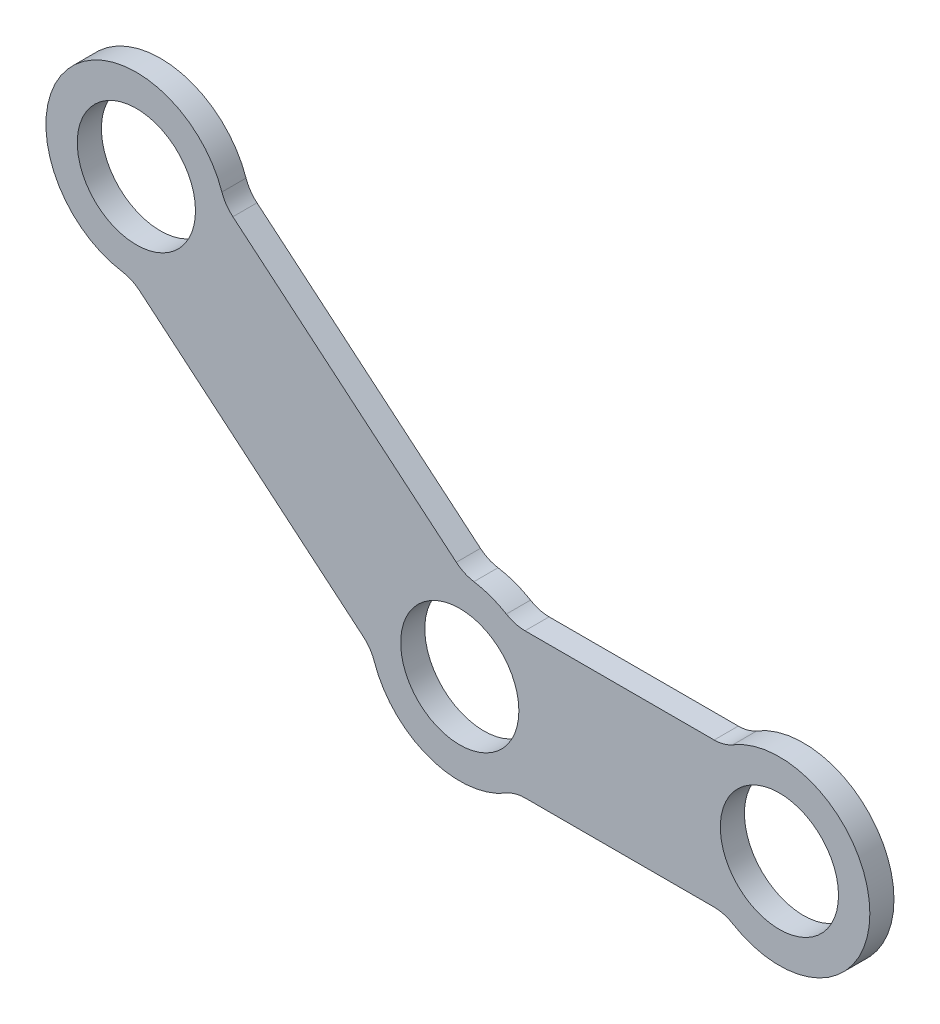
ISO-10303-21;
HEADER;
FILE_DESCRIPTION(('STEP AP214'),'2;1');
FILE_NAME('part.step','',(''),(''),'','','');
FILE_SCHEMA(('AUTOMOTIVE_DESIGN { 1 0 10303 214 1 1 1 1 }'));
ENDSEC;
DATA;
#1=APPLICATION_CONTEXT('core data for automotive mechanical design processes');
#2=APPLICATION_PROTOCOL_DEFINITION('international standard','automotive_design',2000,#1);
#3=PRODUCT_CONTEXT('',#1,'mechanical');
#4=PRODUCT('Part','Part','',(#3));
#5=PRODUCT_RELATED_PRODUCT_CATEGORY('part','',(#4));
#6=PRODUCT_DEFINITION_FORMATION('','',#4);
#7=PRODUCT_DEFINITION_CONTEXT('part definition',#1,'design');
#8=PRODUCT_DEFINITION('design','',#6,#7);
#9=PRODUCT_DEFINITION_SHAPE('','',#8);
#10=(LENGTH_UNIT() NAMED_UNIT(*) SI_UNIT(.MILLI.,.METRE.));
#11=(NAMED_UNIT(*) PLANE_ANGLE_UNIT() SI_UNIT($,.RADIAN.));
#12=(NAMED_UNIT(*) SI_UNIT($,.STERADIAN.) SOLID_ANGLE_UNIT());
#13=UNCERTAINTY_MEASURE_WITH_UNIT(LENGTH_MEASURE(1.E-05),#10,'distance_accuracy_value','');
#14=(GEOMETRIC_REPRESENTATION_CONTEXT(3) GLOBAL_UNCERTAINTY_ASSIGNED_CONTEXT((#13)) GLOBAL_UNIT_ASSIGNED_CONTEXT((#10,
#11,#12)) REPRESENTATION_CONTEXT('',''));
#15=CARTESIAN_POINT('',(0.,0.,0.));
#16=DIRECTION('',(0.,0.,1.));
#17=DIRECTION('',(1.,0.,0.));
#18=AXIS2_PLACEMENT_3D('',#15,#16,#17);
#19=CARTESIAN_POINT('',(-26.8115555091644,22.4975663390287,2.));
#20=DIRECTION('',(0.,0.,-1.));
#21=DIRECTION('',(-1.,0.,0.));
#22=AXIS2_PLACEMENT_3D('',#19,#20,#21);
#23=CYLINDRICAL_SURFACE('',#22,7.5);
#24=CARTESIAN_POINT('',(-26.8115555091644,22.4975663390287,0.));
#25=DIRECTION('',(0.,0.,1.));
#26=DIRECTION('',(1.,0.,0.));
#27=AXIS2_PLACEMENT_3D('',#24,#25,#26);
#28=CIRCLE('',#27,7.5);
#29=CARTESIAN_POINT('',(-27.9844624439888,15.0898481125948,0.));
#30=VERTEX_POINT('',#29);
#31=CARTESIAN_POINT('',(-19.7200503194476,24.938990952696,0.));
#32=VERTEX_POINT('',#31);
#33=EDGE_CURVE('E184',#30,#32,#28,.F.);
#34=ORIENTED_EDGE('',*,*,#33,.F.);
#35=DIRECTION('',(0.,0.,-1.));
#36=VECTOR('',#35,1.);
#37=CARTESIAN_POINT('',(-27.9844624439888,15.0898481125948,2.));
#38=LINE('',#37,#36);
#39=CARTESIAN_POINT('',(-27.9844624439888,15.0898481125948,2.));
#40=VERTEX_POINT('',#39);
#41=EDGE_CURVE('E213',#30,#40,#38,.F.);
#42=ORIENTED_EDGE('',*,*,#41,.T.);
#43=CARTESIAN_POINT('',(-26.8115555091644,22.4975663390287,2.));
#44=DIRECTION('',(0.,0.,1.));
#45=DIRECTION('',(1.,0.,0.));
#46=AXIS2_PLACEMENT_3D('',#43,#44,#45);
#47=CIRCLE('',#46,7.5);
#48=CARTESIAN_POINT('',(-19.7200503194476,24.938990952696,2.));
#49=VERTEX_POINT('',#48);
#50=EDGE_CURVE('E272',#40,#49,#47,.F.);
#51=ORIENTED_EDGE('',*,*,#50,.T.);
#52=DIRECTION('',(0.,0.,-1.));
#53=VECTOR('',#52,1.);
#54=CARTESIAN_POINT('',(-19.7200503194477,24.938990952696,2.));
#55=LINE('',#54,#53);
#56=EDGE_CURVE('E210',#49,#32,#55,.T.);
#57=ORIENTED_EDGE('',*,*,#56,.T.);
#58=EDGE_LOOP('',(#34,#42,#51,#57));
#59=FACE_BOUND('',#58,.T.);
#60=ADVANCED_FACE('F36',(#59),#23,.T.);
#61=CARTESIAN_POINT('',(-3.8567256581192,-4.59626665871389,2.));
#62=DIRECTION('',(-0.642787609686534,-0.766044443118982,0.));
#63=DIRECTION('',(0.766044443118982,-0.642787609686534,0.));
#64=AXIS2_PLACEMENT_3D('',#61,#62,#63);
#65=PLANE('',#64);
#66=DIRECTION('',(-0.766044443118982,0.642787609686534,0.));
#67=VECTOR('',#66,1.);
#68=CARTESIAN_POINT('',(-3.8567256581192,-4.59626665871389,0.));
#69=LINE('',#68,#67);
#70=CARTESIAN_POINT('',(-7.99974443654382,-1.11986112977729,0.));
#71=VERTEX_POINT('',#70);
#72=CARTESIAN_POINT('',(-26.525262388859,14.4248941513782,0.));
#73=VERTEX_POINT('',#72);
#74=EDGE_CURVE('E179',#71,#73,#69,.T.);
#75=ORIENTED_EDGE('',*,*,#74,.F.);
#76=DIRECTION('',(0.,0.,-1.));
#77=VECTOR('',#76,1.);
#78=CARTESIAN_POINT('',(-7.99974443654382,-1.11986112977729,2.));
#79=LINE('',#78,#77);
#80=CARTESIAN_POINT('',(-7.99974443654382,-1.11986112977729,2.));
#81=VERTEX_POINT('',#80);
#82=EDGE_CURVE('E155',#71,#81,#79,.F.);
#83=ORIENTED_EDGE('',*,*,#82,.T.);
#84=DIRECTION('',(-0.766044443118982,0.642787609686534,0.));
#85=VECTOR('',#84,1.);
#86=CARTESIAN_POINT('',(-3.8567256581192,-4.59626665871389,2.));
#87=LINE('',#86,#85);
#88=CARTESIAN_POINT('',(-26.525262388859,14.4248941513782,2.));
#89=VERTEX_POINT('',#88);
#90=EDGE_CURVE('E277',#81,#89,#87,.T.);
#91=ORIENTED_EDGE('',*,*,#90,.T.);
#92=DIRECTION('',(0.,0.,1.));
#93=VECTOR('',#92,1.);
#94=CARTESIAN_POINT('',(-26.525262388859,14.4248941513782,0.));
#95=LINE('',#94,#93);
#96=EDGE_CURVE('E171',#89,#73,#95,.F.);
#97=ORIENTED_EDGE('',*,*,#96,.T.);
#98=EDGE_LOOP('',(#75,#83,#91,#97));
#99=FACE_BOUND('',#98,.T.);
#100=ADVANCED_FACE('F323',(#99),#65,.T.);
#101=CARTESIAN_POINT('',(0.,0.,2.));
#102=DIRECTION('',(0.,0.,-1.));
#103=DIRECTION('',(-1.,0.,0.));
#104=AXIS2_PLACEMENT_3D('',#101,#102,#103);
#105=CYLINDRICAL_SURFACE('',#104,7.5);
#106=CARTESIAN_POINT('',(0.,0.,2.));
#107=DIRECTION('',(0.,0.,1.));
#108=DIRECTION('',(1.,0.,0.));
#109=AXIS2_PLACEMENT_3D('',#106,#107,#108);
#110=CIRCLE('',#109,7.5);
#111=CARTESIAN_POINT('',(-7.09150518971674,-2.44142461366732,2.));
#112=VERTEX_POINT('',#111);
#113=CARTESIAN_POINT('',(3.86309065228285,-6.42857142857143,2.));
#114=VERTEX_POINT('',#113);
#115=EDGE_CURVE('E170',#112,#114,#110,.T.);
#116=ORIENTED_EDGE('',*,*,#115,.F.);
#117=DIRECTION('',(0.,0.,-1.));
#118=VECTOR('',#117,1.);
#119=CARTESIAN_POINT('',(-7.09150518971674,-2.44142461366732,2.));
#120=LINE('',#119,#118);
#121=CARTESIAN_POINT('',(-7.09150518971674,-2.44142461366732,0.));
#122=VERTEX_POINT('',#121);
#123=EDGE_CURVE('E154',#112,#122,#120,.T.);
#124=ORIENTED_EDGE('',*,*,#123,.T.);
#125=CARTESIAN_POINT('',(0.,0.,0.));
#126=DIRECTION('',(0.,0.,1.));
#127=DIRECTION('',(1.,0.,0.));
#128=AXIS2_PLACEMENT_3D('',#125,#126,#127);
#129=CIRCLE('',#128,7.5);
#130=CARTESIAN_POINT('',(3.86309065228285,-6.42857142857143,0.));
#131=VERTEX_POINT('',#130);
#132=EDGE_CURVE('E167',#122,#131,#129,.T.);
#133=ORIENTED_EDGE('',*,*,#132,.T.);
#134=DIRECTION('',(0.,0.,-1.));
#135=VECTOR('',#134,1.);
#136=CARTESIAN_POINT('',(3.86309065228285,-6.42857142857143,2.));
#137=LINE('',#136,#135);
#138=EDGE_CURVE('E172',#131,#114,#137,.F.);
#139=ORIENTED_EDGE('',*,*,#138,.T.);
#140=EDGE_LOOP('',(#116,#124,#133,#139));
#141=FACE_BOUND('',#140,.T.);
#142=ADVANCED_FACE('F166',(#141),#105,.T.);
#143=CARTESIAN_POINT('',(0.,-6.,2.));
#144=DIRECTION('',(0.,1.,0.));
#145=DIRECTION('',(-1.,0.,0.));
#146=AXIS2_PLACEMENT_3D('',#143,#144,#145);
#147=PLANE('',#146);
#148=DIRECTION('',(1.,0.,0.));
#149=VECTOR('',#148,1.);
#150=CARTESIAN_POINT('',(0.,-6.,2.));
#151=LINE('',#150,#149);
#152=CARTESIAN_POINT('',(5.40832691319599,-6.,2.));
#153=VERTEX_POINT('',#152);
#154=CARTESIAN_POINT('',(21.091673086804,-6.00000000000001,2.));
#155=VERTEX_POINT('',#154);
#156=EDGE_CURVE('E285',#153,#155,#151,.T.);
#157=ORIENTED_EDGE('',*,*,#156,.F.);
#158=DIRECTION('',(0.,0.,1.));
#159=VECTOR('',#158,1.);
#160=CARTESIAN_POINT('',(5.40832691319599,-6.,0.));
#161=LINE('',#160,#159);
#162=CARTESIAN_POINT('',(5.40832691319599,-6.,0.));
#163=VERTEX_POINT('',#162);
#164=EDGE_CURVE('E217',#153,#163,#161,.F.);
#165=ORIENTED_EDGE('',*,*,#164,.T.);
#166=DIRECTION('',(1.,0.,0.));
#167=VECTOR('',#166,1.);
#168=CARTESIAN_POINT('',(0.,-6.,0.));
#169=LINE('',#168,#167);
#170=CARTESIAN_POINT('',(21.091673086804,-6.00000000000001,0.));
#171=VERTEX_POINT('',#170);
#172=EDGE_CURVE('E178',#163,#171,#169,.T.);
#173=ORIENTED_EDGE('',*,*,#172,.T.);
#174=DIRECTION('',(0.,0.,1.));
#175=VECTOR('',#174,1.);
#176=CARTESIAN_POINT('',(21.091673086804,-6.00000000000001,2.));
#177=LINE('',#176,#175);
#178=EDGE_CURVE('E215',#171,#155,#177,.T.);
#179=ORIENTED_EDGE('',*,*,#178,.T.);
#180=EDGE_LOOP('',(#157,#165,#173,#179));
#181=FACE_BOUND('',#180,.T.);
#182=ADVANCED_FACE('F332',(#181),#147,.F.);
#183=CARTESIAN_POINT('',(26.5,0.,2.));
#184=DIRECTION('',(0.,0.,-1.));
#185=DIRECTION('',(-1.,0.,0.));
#186=AXIS2_PLACEMENT_3D('',#183,#184,#185);
#187=CYLINDRICAL_SURFACE('',#186,7.5);
#188=CARTESIAN_POINT('',(26.5,0.,2.));
#189=DIRECTION('',(0.,0.,1.));
#190=DIRECTION('',(1.,0.,0.));
#191=AXIS2_PLACEMENT_3D('',#188,#189,#190);
#192=CIRCLE('',#191,7.5);
#193=CARTESIAN_POINT('',(22.6369093477172,-6.42857142857143,2.));
#194=VERTEX_POINT('',#193);
#195=CARTESIAN_POINT('',(22.6369093477171,6.42857142857141,2.));
#196=VERTEX_POINT('',#195);
#197=EDGE_CURVE('E288',#194,#196,#192,.T.);
#198=ORIENTED_EDGE('',*,*,#197,.F.);
#199=DIRECTION('',(0.,0.,-1.));
#200=VECTOR('',#199,1.);
#201=CARTESIAN_POINT('',(22.6369093477172,-6.42857142857143,2.));
#202=LINE('',#201,#200);
#203=CARTESIAN_POINT('',(22.6369093477172,-6.42857142857143,0.));
#204=VERTEX_POINT('',#203);
#205=EDGE_CURVE('E222',#194,#204,#202,.T.);
#206=ORIENTED_EDGE('',*,*,#205,.T.);
#207=CARTESIAN_POINT('',(26.5,0.,0.));
#208=DIRECTION('',(0.,0.,1.));
#209=DIRECTION('',(1.,0.,0.));
#210=AXIS2_PLACEMENT_3D('',#207,#208,#209);
#211=CIRCLE('',#210,7.5);
#212=CARTESIAN_POINT('',(22.6369093477171,6.42857142857141,0.));
#213=VERTEX_POINT('',#212);
#214=EDGE_CURVE('E182',#204,#213,#211,.T.);
#215=ORIENTED_EDGE('',*,*,#214,.T.);
#216=DIRECTION('',(0.,0.,-1.));
#217=VECTOR('',#216,1.);
#218=CARTESIAN_POINT('',(22.6369093477171,6.42857142857141,2.));
#219=LINE('',#218,#217);
#220=EDGE_CURVE('E220',#213,#196,#219,.F.);
#221=ORIENTED_EDGE('',*,*,#220,.T.);
#222=EDGE_LOOP('',(#198,#206,#215,#221));
#223=FACE_BOUND('',#222,.T.);
#224=ADVANCED_FACE('F335',(#223),#187,.T.);
#225=CARTESIAN_POINT('',(0.,6.00000000000001,2.));
#226=DIRECTION('',(0.,1.,0.));
#227=DIRECTION('',(-1.,0.,0.));
#228=AXIS2_PLACEMENT_3D('',#225,#226,#227);
#229=PLANE('',#228);
#230=DIRECTION('',(1.,0.,0.));
#231=VECTOR('',#230,1.);
#232=CARTESIAN_POINT('',(0.,6.00000000000001,2.));
#233=LINE('',#232,#231);
#234=CARTESIAN_POINT('',(5.40832691319598,6.,2.));
#235=VERTEX_POINT('',#234);
#236=CARTESIAN_POINT('',(21.091673086804,5.99999999999997,2.));
#237=VERTEX_POINT('',#236);
#238=EDGE_CURVE('E291',#235,#237,#233,.T.);
#239=ORIENTED_EDGE('',*,*,#238,.T.);
#240=DIRECTION('',(0.,0.,-1.));
#241=VECTOR('',#240,1.);
#242=CARTESIAN_POINT('',(21.091673086804,5.99999999999997,2.));
#243=LINE('',#242,#241);
#244=CARTESIAN_POINT('',(21.091673086804,5.99999999999997,0.));
#245=VERTEX_POINT('',#244);
#246=EDGE_CURVE('E227',#237,#245,#243,.T.);
#247=ORIENTED_EDGE('',*,*,#246,.T.);
#248=DIRECTION('',(1.,0.,0.));
#249=VECTOR('',#248,1.);
#250=CARTESIAN_POINT('',(0.,6.00000000000001,0.));
#251=LINE('',#250,#249);
#252=CARTESIAN_POINT('',(5.40832691319598,6.,0.));
#253=VERTEX_POINT('',#252);
#254=EDGE_CURVE('E190',#253,#245,#251,.T.);
#255=ORIENTED_EDGE('',*,*,#254,.F.);
#256=DIRECTION('',(0.,0.,-1.));
#257=VECTOR('',#256,1.);
#258=CARTESIAN_POINT('',(5.40832691319598,6.,2.));
#259=LINE('',#258,#257);
#260=EDGE_CURVE('E225',#253,#235,#259,.F.);
#261=ORIENTED_EDGE('',*,*,#260,.T.);
#262=EDGE_LOOP('',(#239,#247,#255,#261));
#263=FACE_BOUND('',#262,.T.);
#264=ADVANCED_FACE('F339',(#263),#229,.T.);
#265=CARTESIAN_POINT('',(0.,0.,2.));
#266=DIRECTION('',(0.,0.,-1.));
#267=DIRECTION('',(-1.,0.,0.));
#268=AXIS2_PLACEMENT_3D('',#265,#266,#267);
#269=CYLINDRICAL_SURFACE('',#268,7.5);
#270=CARTESIAN_POINT('',(0.,0.,2.));
#271=DIRECTION('',(0.,0.,1.));
#272=DIRECTION('',(1.,0.,0.));
#273=AXIS2_PLACEMENT_3D('',#270,#271,#272);
#274=CIRCLE('',#273,7.5);
#275=CARTESIAN_POINT('',(3.86309065228284,6.42857142857143,2.));
#276=VERTEX_POINT('',#275);
#277=CARTESIAN_POINT('',(1.17290693482442,7.40771822643389,2.));
#278=VERTEX_POINT('',#277);
#279=EDGE_CURVE('E294',#276,#278,#274,.T.);
#280=ORIENTED_EDGE('',*,*,#279,.F.);
#281=DIRECTION('',(0.,0.,-1.));
#282=VECTOR('',#281,1.);
#283=CARTESIAN_POINT('',(3.86309065228284,6.42857142857143,2.));
#284=LINE('',#283,#282);
#285=CARTESIAN_POINT('',(3.86309065228284,6.42857142857143,0.));
#286=VERTEX_POINT('',#285);
#287=EDGE_CURVE('E232',#276,#286,#284,.T.);
#288=ORIENTED_EDGE('',*,*,#287,.T.);
#289=CARTESIAN_POINT('',(0.,0.,0.));
#290=DIRECTION('',(0.,0.,1.));
#291=DIRECTION('',(1.,0.,0.));
#292=AXIS2_PLACEMENT_3D('',#289,#290,#291);
#293=CIRCLE('',#292,7.5);
#294=CARTESIAN_POINT('',(1.17290693482442,7.40771822643389,0.));
#295=VERTEX_POINT('',#294);
#296=EDGE_CURVE('E193',#286,#295,#293,.T.);
#297=ORIENTED_EDGE('',*,*,#296,.T.);
#298=DIRECTION('',(0.,0.,-1.));
#299=VECTOR('',#298,1.);
#300=CARTESIAN_POINT('',(1.17290693482442,7.40771822643389,2.));
#301=LINE('',#300,#299);
#302=EDGE_CURVE('E230',#295,#278,#301,.F.);
#303=ORIENTED_EDGE('',*,*,#302,.T.);
#304=EDGE_LOOP('',(#280,#288,#297,#303));
#305=FACE_BOUND('',#304,.T.);
#306=ADVANCED_FACE('F343',(#305),#269,.T.);
#307=CARTESIAN_POINT('',(-26.8115555091644,22.4975663390287,2.));
#308=DIRECTION('',(0.,0.,-1.));
#309=DIRECTION('',(-1.,0.,0.));
#310=AXIS2_PLACEMENT_3D('',#307,#308,#309);
#311=CYLINDRICAL_SURFACE('',#310,4.90000000000001);
#312=CARTESIAN_POINT('',(-26.8115555091644,22.4975663390287,2.));
#313=DIRECTION('',(0.,0.,1.));
#314=DIRECTION('',(1.,0.,0.));
#315=AXIS2_PLACEMENT_3D('',#312,#313,#314);
#316=CIRCLE('',#315,4.90000000000001);
#317=CARTESIAN_POINT('',(-21.9115555091644,22.4975663390287,2.));
#318=VERTEX_POINT('',#317);
#319=EDGE_CURVE('E297',#318,#318,#316,.F.);
#320=ORIENTED_EDGE('',*,*,#319,.F.);
#321=EDGE_LOOP('',(#320));
#322=FACE_BOUND('',#321,.T.);
#323=CARTESIAN_POINT('',(-26.8115555091644,22.4975663390287,0.));
#324=DIRECTION('',(0.,0.,1.));
#325=DIRECTION('',(1.,0.,0.));
#326=AXIS2_PLACEMENT_3D('',#323,#324,#325);
#327=CIRCLE('',#326,4.90000000000001);
#328=CARTESIAN_POINT('',(-21.9115555091644,22.4975663390287,0.));
#329=VERTEX_POINT('',#328);
#330=EDGE_CURVE('E198',#329,#329,#327,.F.);
#331=ORIENTED_EDGE('',*,*,#330,.T.);
#332=EDGE_LOOP('',(#331));
#333=FACE_BOUND('',#332,.T.);
#334=ADVANCED_FACE('F318',(#322,#333),#311,.F.);
#335=CARTESIAN_POINT('',(3.8567256581192,4.59626665871389,2.));
#336=DIRECTION('',(-0.642787609686535,-0.766044443118982,0.));
#337=DIRECTION('',(0.766044443118982,-0.642787609686535,0.));
#338=AXIS2_PLACEMENT_3D('',#335,#336,#337);
#339=PLANE('',#338);
#340=DIRECTION('',(-0.766044443118982,0.642787609686535,0.));
#341=VECTOR('',#340,1.);
#342=CARTESIAN_POINT('',(3.8567256581192,4.59626665871389,2.));
#343=LINE('',#342,#341);
#344=CARTESIAN_POINT('',(-0.286293120305421,8.07267218765049,2.));
#345=VERTEX_POINT('',#344);
#346=CARTESIAN_POINT('',(-18.8118110726206,23.617427468806,2.));
#347=VERTEX_POINT('',#346);
#348=EDGE_CURVE('E274',#345,#347,#343,.T.);
#349=ORIENTED_EDGE('',*,*,#348,.F.);
#350=DIRECTION('',(0.,0.,1.));
#351=VECTOR('',#350,1.);
#352=CARTESIAN_POINT('',(-0.286293120305421,8.07267218765049,0.));
#353=LINE('',#352,#351);
#354=CARTESIAN_POINT('',(-0.286293120305421,8.07267218765049,0.));
#355=VERTEX_POINT('',#354);
#356=EDGE_CURVE('E161',#345,#355,#353,.F.);
#357=ORIENTED_EDGE('',*,*,#356,.T.);
#358=DIRECTION('',(-0.766044443118982,0.642787609686535,0.));
#359=VECTOR('',#358,1.);
#360=CARTESIAN_POINT('',(3.8567256581192,4.59626665871389,0.));
#361=LINE('',#360,#359);
#362=CARTESIAN_POINT('',(-18.8118110726206,23.617427468806,0.));
#363=VERTEX_POINT('',#362);
#364=EDGE_CURVE('E196',#355,#363,#361,.T.);
#365=ORIENTED_EDGE('',*,*,#364,.T.);
#366=DIRECTION('',(0.,0.,-1.));
#367=VECTOR('',#366,1.);
#368=CARTESIAN_POINT('',(-18.8118110726206,23.617427468806,2.));
#369=LINE('',#368,#367);
#370=EDGE_CURVE('E51',#363,#347,#369,.F.);
#371=ORIENTED_EDGE('',*,*,#370,.T.);
#372=EDGE_LOOP('',(#349,#357,#365,#371));
#373=FACE_BOUND('',#372,.T.);
#374=ADVANCED_FACE('F265',(#373),#339,.F.);
#375=CARTESIAN_POINT('',(0.,0.,2.));
#376=DIRECTION('',(0.,0.,-1.));
#377=DIRECTION('',(-1.,0.,0.));
#378=AXIS2_PLACEMENT_3D('',#375,#376,#377);
#379=CYLINDRICAL_SURFACE('',#378,4.9);
#380=CARTESIAN_POINT('',(0.,0.,2.));
#381=DIRECTION('',(0.,0.,1.));
#382=DIRECTION('',(1.,0.,0.));
#383=AXIS2_PLACEMENT_3D('',#380,#381,#382);
#384=CIRCLE('',#383,4.9);
#385=CARTESIAN_POINT('',(4.9,0.,2.));
#386=VERTEX_POINT('',#385);
#387=EDGE_CURVE('E204',#386,#386,#384,.T.);
#388=ORIENTED_EDGE('',*,*,#387,.T.);
#389=EDGE_LOOP('',(#388));
#390=FACE_BOUND('',#389,.T.);
#391=CARTESIAN_POINT('',(0.,0.,0.));
#392=DIRECTION('',(0.,0.,1.));
#393=DIRECTION('',(1.,0.,0.));
#394=AXIS2_PLACEMENT_3D('',#391,#392,#393);
#395=CIRCLE('',#394,4.9);
#396=CARTESIAN_POINT('',(4.9,0.,0.));
#397=VERTEX_POINT('',#396);
#398=EDGE_CURVE('E302',#397,#397,#395,.T.);
#399=ORIENTED_EDGE('',*,*,#398,.F.);
#400=EDGE_LOOP('',(#399));
#401=FACE_BOUND('',#400,.T.);
#402=ADVANCED_FACE('F307',(#390,#401),#379,.F.);
#403=CARTESIAN_POINT('',(26.5,0.,2.));
#404=DIRECTION('',(0.,0.,-1.));
#405=DIRECTION('',(-1.,0.,0.));
#406=AXIS2_PLACEMENT_3D('',#403,#404,#405);
#407=CYLINDRICAL_SURFACE('',#406,4.9);
#408=CARTESIAN_POINT('',(26.5,0.,2.));
#409=DIRECTION('',(0.,0.,1.));
#410=DIRECTION('',(1.,0.,0.));
#411=AXIS2_PLACEMENT_3D('',#408,#409,#410);
#412=CIRCLE('',#411,4.9);
#413=CARTESIAN_POINT('',(31.4,0.,2.));
#414=VERTEX_POINT('',#413);
#415=EDGE_CURVE('E205',#414,#414,#412,.T.);
#416=ORIENTED_EDGE('',*,*,#415,.T.);
#417=EDGE_LOOP('',(#416));
#418=FACE_BOUND('',#417,.T.);
#419=CARTESIAN_POINT('',(26.5,0.,0.));
#420=DIRECTION('',(0.,0.,1.));
#421=DIRECTION('',(1.,0.,0.));
#422=AXIS2_PLACEMENT_3D('',#419,#420,#421);
#423=CIRCLE('',#422,4.9);
#424=CARTESIAN_POINT('',(31.4,0.,0.));
#425=VERTEX_POINT('',#424);
#426=EDGE_CURVE('E201',#425,#425,#423,.T.);
#427=ORIENTED_EDGE('',*,*,#426,.F.);
#428=EDGE_LOOP('',(#427));
#429=FACE_BOUND('',#428,.T.);
#430=ADVANCED_FACE('F309',(#418,#429),#407,.F.);
#431=CARTESIAN_POINT('',(0.,0.,2.));
#432=DIRECTION('',(0.,0.,1.));
#433=DIRECTION('',(1.,0.,0.));
#434=AXIS2_PLACEMENT_3D('',#431,#432,#433);
#435=PLANE('',#434);
#436=ORIENTED_EDGE('',*,*,#387,.F.);
#437=EDGE_LOOP('',(#436));
#438=FACE_BOUND('',#437,.T.);
#439=ORIENTED_EDGE('',*,*,#50,.F.);
#440=CARTESIAN_POINT('',(-28.4536252179186,12.1267608220213,2.));
#441=DIRECTION('',(0.,0.,1.));
#442=DIRECTION('',(1.,0.,0.));
#443=AXIS2_PLACEMENT_3D('',#440,#441,#442);
#444=CIRCLE('',#443,3.);
#445=EDGE_CURVE('E241',#40,#89,#444,.F.);
#446=ORIENTED_EDGE('',*,*,#445,.T.);
#447=ORIENTED_EDGE('',*,*,#90,.F.);
#448=CARTESIAN_POINT('',(-9.92810726560343,-3.41799445913424,2.));
#449=DIRECTION('',(0.,0.,1.));
#450=DIRECTION('',(1.,0.,0.));
#451=AXIS2_PLACEMENT_3D('',#448,#449,#450);
#452=CIRCLE('',#451,3.);
#453=EDGE_CURVE('E160',#81,#112,#452,.F.);
#454=ORIENTED_EDGE('',*,*,#453,.T.);
#455=ORIENTED_EDGE('',*,*,#115,.T.);
#456=CARTESIAN_POINT('',(5.40832691319599,-9.,2.));
#457=DIRECTION('',(0.,0.,1.));
#458=DIRECTION('',(1.,0.,0.));
#459=AXIS2_PLACEMENT_3D('',#456,#457,#458);
#460=CIRCLE('',#459,3.);
#461=EDGE_CURVE('E244',#114,#153,#460,.F.);
#462=ORIENTED_EDGE('',*,*,#461,.T.);
#463=ORIENTED_EDGE('',*,*,#156,.T.);
#464=CARTESIAN_POINT('',(21.091673086804,-9.00000000000001,2.));
#465=DIRECTION('',(0.,0.,1.));
#466=DIRECTION('',(1.,0.,0.));
#467=AXIS2_PLACEMENT_3D('',#464,#465,#466);
#468=CIRCLE('',#467,3.);
#469=EDGE_CURVE('E248',#155,#194,#468,.F.);
#470=ORIENTED_EDGE('',*,*,#469,.T.);
#471=ORIENTED_EDGE('',*,*,#197,.T.);
#472=CARTESIAN_POINT('',(21.091673086804,8.99999999999997,2.));
#473=DIRECTION('',(0.,0.,1.));
#474=DIRECTION('',(1.,0.,0.));
#475=AXIS2_PLACEMENT_3D('',#472,#473,#474);
#476=CIRCLE('',#475,3.);
#477=EDGE_CURVE('E252',#196,#237,#476,.F.);
#478=ORIENTED_EDGE('',*,*,#477,.T.);
#479=ORIENTED_EDGE('',*,*,#238,.F.);
#480=CARTESIAN_POINT('',(5.40832691319598,9.,2.));
#481=DIRECTION('',(0.,0.,1.));
#482=DIRECTION('',(1.,0.,0.));
#483=AXIS2_PLACEMENT_3D('',#480,#481,#482);
#484=CIRCLE('',#483,3.);
#485=EDGE_CURVE('E256',#235,#276,#484,.F.);
#486=ORIENTED_EDGE('',*,*,#485,.T.);
#487=ORIENTED_EDGE('',*,*,#279,.T.);
#488=CARTESIAN_POINT('',(1.64206970875418,10.3708055170074,2.));
#489=DIRECTION('',(0.,0.,1.));
#490=DIRECTION('',(1.,0.,0.));
#491=AXIS2_PLACEMENT_3D('',#488,#489,#490);
#492=CIRCLE('',#491,3.);
#493=EDGE_CURVE('E58',#278,#345,#492,.F.);
#494=ORIENTED_EDGE('',*,*,#493,.T.);
#495=ORIENTED_EDGE('',*,*,#348,.T.);
#496=CARTESIAN_POINT('',(-16.883448243561,25.915560798163,2.));
#497=DIRECTION('',(0.,0.,1.));
#498=DIRECTION('',(1.,0.,0.));
#499=AXIS2_PLACEMENT_3D('',#496,#497,#498);
#500=CIRCLE('',#499,3.);
#501=EDGE_CURVE('E11',#347,#49,#500,.F.);
#502=ORIENTED_EDGE('',*,*,#501,.T.);
#503=EDGE_LOOP('',(#439,#446,#447,#454,#455,#462,#463,#470,#471,#478,#479,#486,#487,#494,#495,#502));
#504=FACE_BOUND('',#503,.T.);
#505=ORIENTED_EDGE('',*,*,#319,.T.);
#506=EDGE_LOOP('',(#505));
#507=FACE_BOUND('',#506,.T.);
#508=ORIENTED_EDGE('',*,*,#415,.F.);
#509=EDGE_LOOP('',(#508));
#510=FACE_BOUND('',#509,.T.);
#511=ADVANCED_FACE('F270',(#438,#504,#507,#510),#435,.T.);
#512=CARTESIAN_POINT('',(0.,0.,0.));
#513=DIRECTION('',(0.,0.,1.));
#514=DIRECTION('',(1.,0.,0.));
#515=AXIS2_PLACEMENT_3D('',#512,#513,#514);
#516=PLANE('',#515);
#517=ORIENTED_EDGE('',*,*,#398,.T.);
#518=EDGE_LOOP('',(#517));
#519=FACE_BOUND('',#518,.T.);
#520=ORIENTED_EDGE('',*,*,#74,.T.);
#521=CARTESIAN_POINT('',(-28.4536252179186,12.1267608220213,0.));
#522=DIRECTION('',(0.,0.,1.));
#523=DIRECTION('',(1.,0.,0.));
#524=AXIS2_PLACEMENT_3D('',#521,#522,#523);
#525=CIRCLE('',#524,3.);
#526=EDGE_CURVE('E239',#73,#30,#525,.T.);
#527=ORIENTED_EDGE('',*,*,#526,.T.);
#528=ORIENTED_EDGE('',*,*,#33,.T.);
#529=CARTESIAN_POINT('',(-16.883448243561,25.915560798163,0.));
#530=DIRECTION('',(0.,0.,1.));
#531=DIRECTION('',(1.,0.,0.));
#532=AXIS2_PLACEMENT_3D('',#529,#530,#531);
#533=CIRCLE('',#532,3.);
#534=EDGE_CURVE('E44',#32,#363,#533,.T.);
#535=ORIENTED_EDGE('',*,*,#534,.T.);
#536=ORIENTED_EDGE('',*,*,#364,.F.);
#537=CARTESIAN_POINT('',(1.64206970875418,10.3708055170074,0.));
#538=DIRECTION('',(0.,0.,1.));
#539=DIRECTION('',(1.,0.,0.));
#540=AXIS2_PLACEMENT_3D('',#537,#538,#539);
#541=CIRCLE('',#540,3.);
#542=EDGE_CURVE('E258',#355,#295,#541,.T.);
#543=ORIENTED_EDGE('',*,*,#542,.T.);
#544=ORIENTED_EDGE('',*,*,#296,.F.);
#545=CARTESIAN_POINT('',(5.40832691319598,9.,0.));
#546=DIRECTION('',(0.,0.,1.));
#547=DIRECTION('',(1.,0.,0.));
#548=AXIS2_PLACEMENT_3D('',#545,#546,#547);
#549=CIRCLE('',#548,3.);
#550=EDGE_CURVE('E254',#286,#253,#549,.T.);
#551=ORIENTED_EDGE('',*,*,#550,.T.);
#552=ORIENTED_EDGE('',*,*,#254,.T.);
#553=CARTESIAN_POINT('',(21.091673086804,8.99999999999997,0.));
#554=DIRECTION('',(0.,0.,1.));
#555=DIRECTION('',(1.,0.,0.));
#556=AXIS2_PLACEMENT_3D('',#553,#554,#555);
#557=CIRCLE('',#556,3.);
#558=EDGE_CURVE('E250',#245,#213,#557,.T.);
#559=ORIENTED_EDGE('',*,*,#558,.T.);
#560=ORIENTED_EDGE('',*,*,#214,.F.);
#561=CARTESIAN_POINT('',(21.091673086804,-9.00000000000001,0.));
#562=DIRECTION('',(0.,0.,1.));
#563=DIRECTION('',(1.,0.,0.));
#564=AXIS2_PLACEMENT_3D('',#561,#562,#563);
#565=CIRCLE('',#564,3.);
#566=EDGE_CURVE('E246',#204,#171,#565,.T.);
#567=ORIENTED_EDGE('',*,*,#566,.T.);
#568=ORIENTED_EDGE('',*,*,#172,.F.);
#569=CARTESIAN_POINT('',(5.40832691319599,-9.,0.));
#570=DIRECTION('',(0.,0.,1.));
#571=DIRECTION('',(1.,0.,0.));
#572=AXIS2_PLACEMENT_3D('',#569,#570,#571);
#573=CIRCLE('',#572,3.);
#574=EDGE_CURVE('E177',#163,#131,#573,.T.);
#575=ORIENTED_EDGE('',*,*,#574,.T.);
#576=ORIENTED_EDGE('',*,*,#132,.F.);
#577=CARTESIAN_POINT('',(-9.92810726560343,-3.41799445913424,0.));
#578=DIRECTION('',(0.,0.,1.));
#579=DIRECTION('',(1.,0.,0.));
#580=AXIS2_PLACEMENT_3D('',#577,#578,#579);
#581=CIRCLE('',#580,3.);
#582=EDGE_CURVE('E150',#122,#71,#581,.T.);
#583=ORIENTED_EDGE('',*,*,#582,.T.);
#584=EDGE_LOOP('',(#520,#527,#528,#535,#536,#543,#544,#551,#552,#559,#560,#567,#568,#575,#576,#583));
#585=FACE_BOUND('',#584,.T.);
#586=ORIENTED_EDGE('',*,*,#330,.F.);
#587=EDGE_LOOP('',(#586));
#588=FACE_BOUND('',#587,.T.);
#589=ORIENTED_EDGE('',*,*,#426,.T.);
#590=EDGE_LOOP('',(#589));
#591=FACE_BOUND('',#590,.T.);
#592=ADVANCED_FACE('F174',(#519,#585,#588,#591),#516,.F.);
#593=CARTESIAN_POINT('',(-9.92810726560343,-3.41799445913424,2.));
#594=DIRECTION('',(0.,0.,-1.));
#595=DIRECTION('',(-1.,0.,0.));
#596=AXIS2_PLACEMENT_3D('',#593,#594,#595);
#597=CYLINDRICAL_SURFACE('',#596,3.);
#598=ORIENTED_EDGE('',*,*,#453,.F.);
#599=ORIENTED_EDGE('',*,*,#82,.F.);
#600=ORIENTED_EDGE('',*,*,#582,.F.);
#601=ORIENTED_EDGE('',*,*,#123,.F.);
#602=EDGE_LOOP('',(#598,#599,#600,#601));
#603=FACE_BOUND('',#602,.T.);
#604=ADVANCED_FACE('F153',(#603),#597,.F.);
#605=CARTESIAN_POINT('',(-28.4536252179186,12.1267608220213,2.));
#606=DIRECTION('',(0.,0.,-1.));
#607=DIRECTION('',(-1.,0.,0.));
#608=AXIS2_PLACEMENT_3D('',#605,#606,#607);
#609=CYLINDRICAL_SURFACE('',#608,3.);
#610=ORIENTED_EDGE('',*,*,#445,.F.);
#611=ORIENTED_EDGE('',*,*,#41,.F.);
#612=ORIENTED_EDGE('',*,*,#526,.F.);
#613=ORIENTED_EDGE('',*,*,#96,.F.);
#614=EDGE_LOOP('',(#610,#611,#612,#613));
#615=FACE_BOUND('',#614,.T.);
#616=ADVANCED_FACE('F371',(#615),#609,.F.);
#617=CARTESIAN_POINT('',(5.40832691319599,-9.,2.));
#618=DIRECTION('',(0.,0.,-1.));
#619=DIRECTION('',(-1.,0.,0.));
#620=AXIS2_PLACEMENT_3D('',#617,#618,#619);
#621=CYLINDRICAL_SURFACE('',#620,3.);
#622=ORIENTED_EDGE('',*,*,#461,.F.);
#623=ORIENTED_EDGE('',*,*,#138,.F.);
#624=ORIENTED_EDGE('',*,*,#574,.F.);
#625=ORIENTED_EDGE('',*,*,#164,.F.);
#626=EDGE_LOOP('',(#622,#623,#624,#625));
#627=FACE_BOUND('',#626,.T.);
#628=ADVANCED_FACE('F377',(#627),#621,.F.);
#629=CARTESIAN_POINT('',(21.091673086804,-9.00000000000001,2.));
#630=DIRECTION('',(0.,0.,-1.));
#631=DIRECTION('',(-1.,0.,0.));
#632=AXIS2_PLACEMENT_3D('',#629,#630,#631);
#633=CYLINDRICAL_SURFACE('',#632,3.);
#634=ORIENTED_EDGE('',*,*,#469,.F.);
#635=ORIENTED_EDGE('',*,*,#178,.F.);
#636=ORIENTED_EDGE('',*,*,#566,.F.);
#637=ORIENTED_EDGE('',*,*,#205,.F.);
#638=EDGE_LOOP('',(#634,#635,#636,#637));
#639=FACE_BOUND('',#638,.T.);
#640=ADVANCED_FACE('F385',(#639),#633,.F.);
#641=CARTESIAN_POINT('',(21.091673086804,8.99999999999997,2.));
#642=DIRECTION('',(0.,0.,-1.));
#643=DIRECTION('',(-1.,0.,0.));
#644=AXIS2_PLACEMENT_3D('',#641,#642,#643);
#645=CYLINDRICAL_SURFACE('',#644,3.);
#646=ORIENTED_EDGE('',*,*,#477,.F.);
#647=ORIENTED_EDGE('',*,*,#220,.F.);
#648=ORIENTED_EDGE('',*,*,#558,.F.);
#649=ORIENTED_EDGE('',*,*,#246,.F.);
#650=EDGE_LOOP('',(#646,#647,#648,#649));
#651=FACE_BOUND('',#650,.T.);
#652=ADVANCED_FACE('F393',(#651),#645,.F.);
#653=CARTESIAN_POINT('',(5.40832691319598,9.,2.));
#654=DIRECTION('',(0.,0.,-1.));
#655=DIRECTION('',(-1.,0.,0.));
#656=AXIS2_PLACEMENT_3D('',#653,#654,#655);
#657=CYLINDRICAL_SURFACE('',#656,3.);
#658=ORIENTED_EDGE('',*,*,#485,.F.);
#659=ORIENTED_EDGE('',*,*,#260,.F.);
#660=ORIENTED_EDGE('',*,*,#550,.F.);
#661=ORIENTED_EDGE('',*,*,#287,.F.);
#662=EDGE_LOOP('',(#658,#659,#660,#661));
#663=FACE_BOUND('',#662,.T.);
#664=ADVANCED_FACE('F401',(#663),#657,.F.);
#665=CARTESIAN_POINT('',(1.64206970875418,10.3708055170074,2.));
#666=DIRECTION('',(0.,0.,-1.));
#667=DIRECTION('',(-1.,0.,0.));
#668=AXIS2_PLACEMENT_3D('',#665,#666,#667);
#669=CYLINDRICAL_SURFACE('',#668,3.);
#670=ORIENTED_EDGE('',*,*,#493,.F.);
#671=ORIENTED_EDGE('',*,*,#302,.F.);
#672=ORIENTED_EDGE('',*,*,#542,.F.);
#673=ORIENTED_EDGE('',*,*,#356,.F.);
#674=EDGE_LOOP('',(#670,#671,#672,#673));
#675=FACE_BOUND('',#674,.T.);
#676=ADVANCED_FACE('F409',(#675),#669,.F.);
#677=CARTESIAN_POINT('',(-16.883448243561,25.915560798163,2.));
#678=DIRECTION('',(0.,0.,-1.));
#679=DIRECTION('',(-1.,0.,0.));
#680=AXIS2_PLACEMENT_3D('',#677,#678,#679);
#681=CYLINDRICAL_SURFACE('',#680,3.);
#682=ORIENTED_EDGE('',*,*,#501,.F.);
#683=ORIENTED_EDGE('',*,*,#370,.F.);
#684=ORIENTED_EDGE('',*,*,#534,.F.);
#685=ORIENTED_EDGE('',*,*,#56,.F.);
#686=EDGE_LOOP('',(#682,#683,#684,#685));
#687=FACE_BOUND('',#686,.T.);
#688=ADVANCED_FACE('F38',(#687),#681,.F.);
#689=CLOSED_SHELL('',(#60,#100,#142,#182,#224,#264,#306,#334,#374,#402,#430,#511,#592,#604,#616,
#628,#640,#652,#664,#676,#688));
#690=MANIFOLD_SOLID_BREP('B2',#689);
#691=ADVANCED_BREP_SHAPE_REPRESENTATION('',(#18,#690),#14);
#692=SHAPE_DEFINITION_REPRESENTATION(#9,#691);
ENDSEC;
END-ISO-10303-21;
